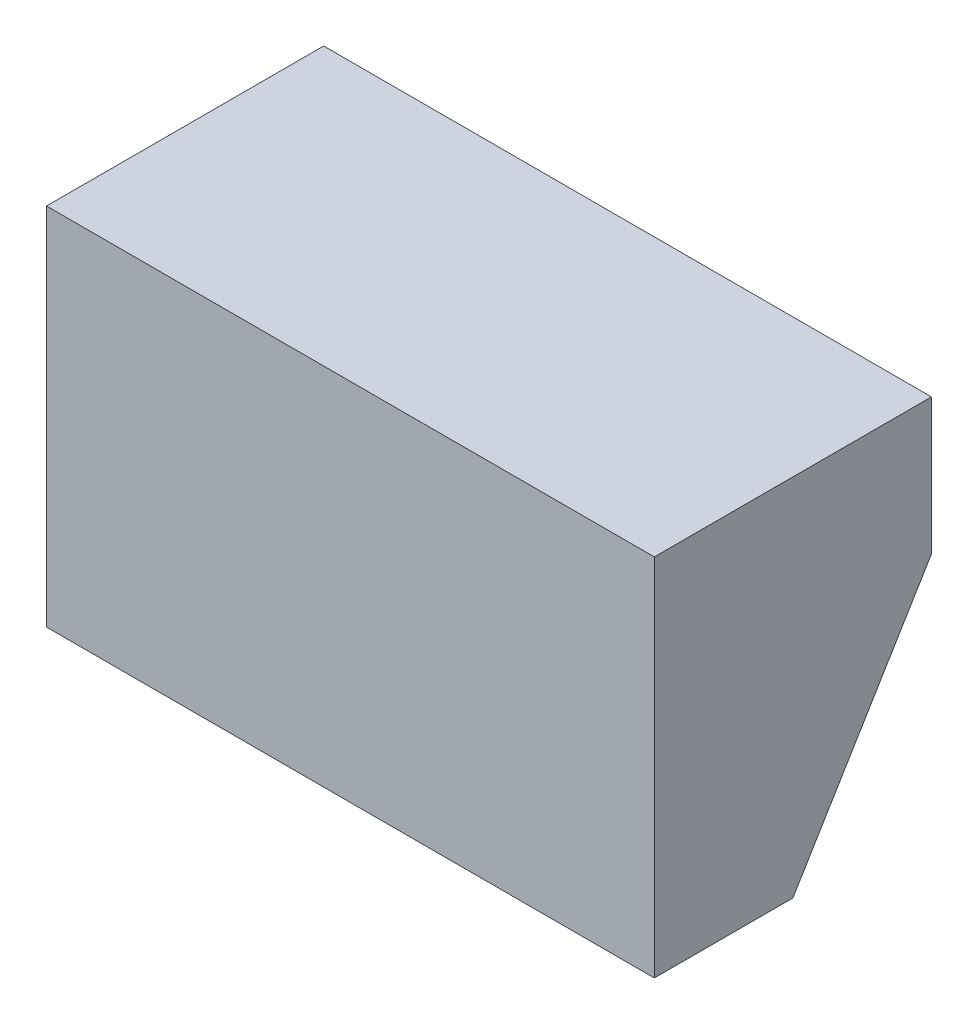
ISO-10303-21;
HEADER;
FILE_DESCRIPTION(('STEP AP214'),'2;1');
FILE_NAME('part.step','',(''),(''),'','','');
FILE_SCHEMA(('AUTOMOTIVE_DESIGN { 1 0 10303 214 1 1 1 1 }'));
ENDSEC;
DATA;
#1=APPLICATION_CONTEXT('core data for automotive mechanical design processes');
#2=APPLICATION_PROTOCOL_DEFINITION('international standard','automotive_design',2000,#1);
#3=PRODUCT_CONTEXT('',#1,'mechanical');
#4=PRODUCT('Part','Part','',(#3));
#5=PRODUCT_RELATED_PRODUCT_CATEGORY('part','',(#4));
#6=PRODUCT_DEFINITION_FORMATION('','',#4);
#7=PRODUCT_DEFINITION_CONTEXT('part definition',#1,'design');
#8=PRODUCT_DEFINITION('design','',#6,#7);
#9=PRODUCT_DEFINITION_SHAPE('','',#8);
#10=(LENGTH_UNIT() NAMED_UNIT(*) SI_UNIT(.MILLI.,.METRE.));
#11=(NAMED_UNIT(*) PLANE_ANGLE_UNIT() SI_UNIT($,.RADIAN.));
#12=(NAMED_UNIT(*) SI_UNIT($,.STERADIAN.) SOLID_ANGLE_UNIT());
#13=UNCERTAINTY_MEASURE_WITH_UNIT(LENGTH_MEASURE(1.E-05),#10,'distance_accuracy_value','');
#14=(GEOMETRIC_REPRESENTATION_CONTEXT(3) GLOBAL_UNCERTAINTY_ASSIGNED_CONTEXT((#13)) GLOBAL_UNIT_ASSIGNED_CONTEXT((#10,
#11,#12)) REPRESENTATION_CONTEXT('',''));
#15=CARTESIAN_POINT('',(0.,0.,0.));
#16=DIRECTION('',(0.,0.,1.));
#17=DIRECTION('',(1.,0.,0.));
#18=AXIS2_PLACEMENT_3D('',#15,#16,#17);
#19=CARTESIAN_POINT('',(125.,-75.,114.));
#20=DIRECTION('',(-1.,0.,0.));
#21=DIRECTION('',(0.,0.,1.));
#22=AXIS2_PLACEMENT_3D('',#19,#20,#21);
#23=PLANE('',#22);
#24=DIRECTION('',(0.,-0.855226725322334,0.518254038377355));
#25=VECTOR('',#24,1.);
#26=CARTESIAN_POINT('',(125.,-100.263808135213,72.3094731527829));
#27=LINE('',#26,#25);
#28=CARTESIAN_POINT('',(125.,19.0618301711685,0.));
#29=VERTEX_POINT('',#28);
#30=CARTESIAN_POINT('',(125.,-75.,56.9999999999999));
#31=VERTEX_POINT('',#30);
#32=EDGE_CURVE('E110',#29,#31,#27,.T.);
#33=ORIENTED_EDGE('',*,*,#32,.F.);
#34=DIRECTION('',(0.,1.,0.));
#35=VECTOR('',#34,1.);
#36=CARTESIAN_POINT('',(125.,-75.,0.));
#37=LINE('',#36,#35);
#38=CARTESIAN_POINT('',(125.,75.,0.));
#39=VERTEX_POINT('',#38);
#40=EDGE_CURVE('E118',#29,#39,#37,.T.);
#41=ORIENTED_EDGE('',*,*,#40,.T.);
#42=DIRECTION('',(0.,0.,-1.));
#43=VECTOR('',#42,1.);
#44=CARTESIAN_POINT('',(125.,75.,114.));
#45=LINE('',#44,#43);
#46=CARTESIAN_POINT('',(125.,75.,114.));
#47=VERTEX_POINT('',#46);
#48=EDGE_CURVE('E46',#47,#39,#45,.T.);
#49=ORIENTED_EDGE('',*,*,#48,.F.);
#50=DIRECTION('',(0.,1.,0.));
#51=VECTOR('',#50,1.);
#52=CARTESIAN_POINT('',(125.,-75.,114.));
#53=LINE('',#52,#51);
#54=CARTESIAN_POINT('',(125.,-75.,114.));
#55=VERTEX_POINT('',#54);
#56=EDGE_CURVE('E139',#55,#47,#53,.T.);
#57=ORIENTED_EDGE('',*,*,#56,.F.);
#58=DIRECTION('',(0.,0.,-1.));
#59=VECTOR('',#58,1.);
#60=CARTESIAN_POINT('',(125.,-75.,114.));
#61=LINE('',#60,#59);
#62=EDGE_CURVE('E121',#55,#31,#61,.T.);
#63=ORIENTED_EDGE('',*,*,#62,.T.);
#64=EDGE_LOOP('',(#33,#41,#49,#57,#63));
#65=FACE_BOUND('',#64,.T.);
#66=ADVANCED_FACE('F38',(#65),#23,.F.);
#67=CARTESIAN_POINT('',(-125.,-75.,114.));
#68=DIRECTION('',(0.,1.,0.));
#69=DIRECTION('',(0.,0.,1.));
#70=AXIS2_PLACEMENT_3D('',#67,#68,#69);
#71=PLANE('',#70);
#72=DIRECTION('',(-0.823397266330031,0.,-0.567465366168044));
#73=VECTOR('',#72,1.);
#74=CARTESIAN_POINT('',(-17.862546969277,-75.,-41.4573921273211));
#75=LINE('',#74,#73);
#76=CARTESIAN_POINT('',(42.292495755744,-75.,0.));
#77=VERTEX_POINT('',#76);
#78=EDGE_CURVE('E57',#31,#77,#75,.T.);
#79=ORIENTED_EDGE('',*,*,#78,.F.);
#80=ORIENTED_EDGE('',*,*,#62,.F.);
#81=DIRECTION('',(1.,0.,0.));
#82=VECTOR('',#81,1.);
#83=CARTESIAN_POINT('',(-125.,-75.,114.));
#84=LINE('',#83,#82);
#85=CARTESIAN_POINT('',(-125.,-75.,114.));
#86=VERTEX_POINT('',#85);
#87=EDGE_CURVE('E67',#86,#55,#84,.T.);
#88=ORIENTED_EDGE('',*,*,#87,.F.);
#89=DIRECTION('',(0.,0.,-1.));
#90=VECTOR('',#89,1.);
#91=CARTESIAN_POINT('',(-125.,-75.,114.));
#92=LINE('',#91,#90);
#93=CARTESIAN_POINT('',(-125.,-75.,0.));
#94=VERTEX_POINT('',#93);
#95=EDGE_CURVE('E142',#86,#94,#92,.T.);
#96=ORIENTED_EDGE('',*,*,#95,.T.);
#97=DIRECTION('',(1.,0.,0.));
#98=VECTOR('',#97,1.);
#99=CARTESIAN_POINT('',(-125.,-75.,0.));
#100=LINE('',#99,#98);
#101=EDGE_CURVE('E136',#94,#77,#100,.T.);
#102=ORIENTED_EDGE('',*,*,#101,.T.);
#103=EDGE_LOOP('',(#79,#80,#88,#96,#102));
#104=FACE_BOUND('',#103,.T.);
#105=ADVANCED_FACE('F168',(#104),#71,.F.);
#106=CARTESIAN_POINT('',(0.,0.,0.));
#107=DIRECTION('',(0.,0.,-1.));
#108=DIRECTION('',(-1.,0.,0.));
#109=AXIS2_PLACEMENT_3D('',#106,#107,#108);
#110=PLANE('',#109);
#111=CARTESIAN_POINT('',(-25.5219113985845,0.,0.));
#112=DIRECTION('',(0.,0.,-1.));
#113=DIRECTION('',(-1.,0.,0.));
#114=AXIS2_PLACEMENT_3D('',#111,#112,#113);
#115=CIRCLE('',#114,21.2566947196087);
#116=CARTESIAN_POINT('',(-46.7786061181932,0.,0.));
#117=VERTEX_POINT('',#116);
#118=EDGE_CURVE('E174',#117,#117,#115,.T.);
#119=ORIENTED_EDGE('',*,*,#118,.F.);
#120=EDGE_LOOP('',(#119));
#121=FACE_BOUND('',#120,.T.);
#122=ORIENTED_EDGE('',*,*,#40,.F.);
#123=DIRECTION('',(-0.66032679808164,-0.750978375011724,0.));
#124=VECTOR('',#123,1.);
#125=CARTESIAN_POINT('',(61.0434721622796,-53.6748351989157,0.));
#126=LINE('',#125,#124);
#127=EDGE_CURVE('E11',#29,#77,#126,.T.);
#128=ORIENTED_EDGE('',*,*,#127,.T.);
#129=ORIENTED_EDGE('',*,*,#101,.F.);
#130=DIRECTION('',(0.,-1.,0.));
#131=VECTOR('',#130,1.);
#132=CARTESIAN_POINT('',(-125.,-75.,0.));
#133=LINE('',#132,#131);
#134=CARTESIAN_POINT('',(-125.,75.,0.));
#135=VERTEX_POINT('',#134);
#136=EDGE_CURVE('E91',#135,#94,#133,.T.);
#137=ORIENTED_EDGE('',*,*,#136,.F.);
#138=DIRECTION('',(-1.,0.,0.));
#139=VECTOR('',#138,1.);
#140=CARTESIAN_POINT('',(-125.,75.,0.));
#141=LINE('',#140,#139);
#142=EDGE_CURVE('E125',#39,#135,#141,.T.);
#143=ORIENTED_EDGE('',*,*,#142,.F.);
#144=EDGE_LOOP('',(#122,#128,#129,#137,#143));
#145=FACE_BOUND('',#144,.T.);
#146=ADVANCED_FACE('F124',(#121,#145),#110,.T.);
#147=CARTESIAN_POINT('',(-125.,75.,114.));
#148=DIRECTION('',(0.,-1.,0.));
#149=DIRECTION('',(0.,0.,-1.));
#150=AXIS2_PLACEMENT_3D('',#147,#148,#149);
#151=PLANE('',#150);
#152=ORIENTED_EDGE('',*,*,#142,.T.);
#153=DIRECTION('',(0.,0.,-1.));
#154=VECTOR('',#153,1.);
#155=CARTESIAN_POINT('',(-125.,75.,114.));
#156=LINE('',#155,#154);
#157=CARTESIAN_POINT('',(-125.,75.,114.));
#158=VERTEX_POINT('',#157);
#159=EDGE_CURVE('E145',#158,#135,#156,.T.);
#160=ORIENTED_EDGE('',*,*,#159,.F.);
#161=DIRECTION('',(-1.,0.,0.));
#162=VECTOR('',#161,1.);
#163=CARTESIAN_POINT('',(-125.,75.,114.));
#164=LINE('',#163,#162);
#165=EDGE_CURVE('E101',#47,#158,#164,.T.);
#166=ORIENTED_EDGE('',*,*,#165,.F.);
#167=ORIENTED_EDGE('',*,*,#48,.T.);
#168=EDGE_LOOP('',(#152,#160,#166,#167));
#169=FACE_BOUND('',#168,.T.);
#170=ADVANCED_FACE('F149',(#169),#151,.F.);
#171=CARTESIAN_POINT('',(-125.,-75.,114.));
#172=DIRECTION('',(1.,0.,0.));
#173=DIRECTION('',(0.,0.,-1.));
#174=AXIS2_PLACEMENT_3D('',#171,#172,#173);
#175=PLANE('',#174);
#176=ORIENTED_EDGE('',*,*,#136,.T.);
#177=ORIENTED_EDGE('',*,*,#95,.F.);
#178=DIRECTION('',(0.,-1.,0.));
#179=VECTOR('',#178,1.);
#180=CARTESIAN_POINT('',(-125.,-75.,114.));
#181=LINE('',#180,#179);
#182=EDGE_CURVE('E154',#158,#86,#181,.T.);
#183=ORIENTED_EDGE('',*,*,#182,.F.);
#184=ORIENTED_EDGE('',*,*,#159,.T.);
#185=EDGE_LOOP('',(#176,#177,#183,#184));
#186=FACE_BOUND('',#185,.T.);
#187=ADVANCED_FACE('F166',(#186),#175,.F.);
#188=CARTESIAN_POINT('',(0.,0.,114.));
#189=DIRECTION('',(0.,0.,-1.));
#190=DIRECTION('',(-1.,0.,0.));
#191=AXIS2_PLACEMENT_3D('',#188,#189,#190);
#192=PLANE('',#191);
#193=ORIENTED_EDGE('',*,*,#56,.T.);
#194=ORIENTED_EDGE('',*,*,#165,.T.);
#195=ORIENTED_EDGE('',*,*,#182,.T.);
#196=ORIENTED_EDGE('',*,*,#87,.T.);
#197=EDGE_LOOP('',(#193,#194,#195,#196));
#198=FACE_BOUND('',#197,.T.);
#199=ADVANCED_FACE('F165',(#198),#192,.F.);
#200=CARTESIAN_POINT('',(27.9069349234818,-24.5382524923008,-40.4932094496149));
#201=DIRECTION('',(0.507766315458884,-0.446473182740372,-0.736773415629929));
#202=DIRECTION('',(-0.823397266330031,0.,-0.567465366168044));
#203=AXIS2_PLACEMENT_3D('',#200,#201,#202);
#204=PLANE('',#203);
#205=ORIENTED_EDGE('',*,*,#32,.T.);
#206=ORIENTED_EDGE('',*,*,#78,.T.);
#207=ORIENTED_EDGE('',*,*,#127,.F.);
#208=EDGE_LOOP('',(#205,#206,#207));
#209=FACE_BOUND('',#208,.T.);
#210=ADVANCED_FACE('F109',(#209),#204,.T.);
#211=CARTESIAN_POINT('',(-25.5219113985845,0.,54.));
#212=DIRECTION('',(0.,0.,-1.));
#213=DIRECTION('',(-1.,0.,0.));
#214=AXIS2_PLACEMENT_3D('',#211,#212,#213);
#215=CYLINDRICAL_SURFACE('',#214,21.2566947196087);
#216=CARTESIAN_POINT('',(-25.5219113985845,0.,54.));
#217=DIRECTION('',(0.,0.,-1.));
#218=DIRECTION('',(-1.,0.,0.));
#219=AXIS2_PLACEMENT_3D('',#216,#217,#218);
#220=CIRCLE('',#219,21.2566947196087);
#221=CARTESIAN_POINT('',(-46.7786061181932,0.,54.));
#222=VERTEX_POINT('',#221);
#223=EDGE_CURVE('E170',#222,#222,#220,.T.);
#224=ORIENTED_EDGE('',*,*,#223,.F.);
#225=EDGE_LOOP('',(#224));
#226=FACE_BOUND('',#225,.T.);
#227=ORIENTED_EDGE('',*,*,#118,.T.);
#228=EDGE_LOOP('',(#227));
#229=FACE_BOUND('',#228,.T.);
#230=ADVANCED_FACE('F181',(#226,#229),#215,.F.);
#231=CARTESIAN_POINT('',(-25.5219113985845,0.,54.));
#232=DIRECTION('',(0.,0.,-1.));
#233=DIRECTION('',(-1.,0.,0.));
#234=AXIS2_PLACEMENT_3D('',#231,#232,#233);
#235=PLANE('',#234);
#236=ORIENTED_EDGE('',*,*,#223,.T.);
#237=EDGE_LOOP('',(#236));
#238=FACE_BOUND('',#237,.T.);
#239=ADVANCED_FACE('F242',(#238),#235,.T.);
#240=CLOSED_SHELL('',(#66,#105,#146,#170,#187,#199,#210,#230,#239));
#241=MANIFOLD_SOLID_BREP('B2',#240);
#242=ADVANCED_BREP_SHAPE_REPRESENTATION('',(#18,#241),#14);
#243=SHAPE_DEFINITION_REPRESENTATION(#9,#242);
ENDSEC;
END-ISO-10303-21;
